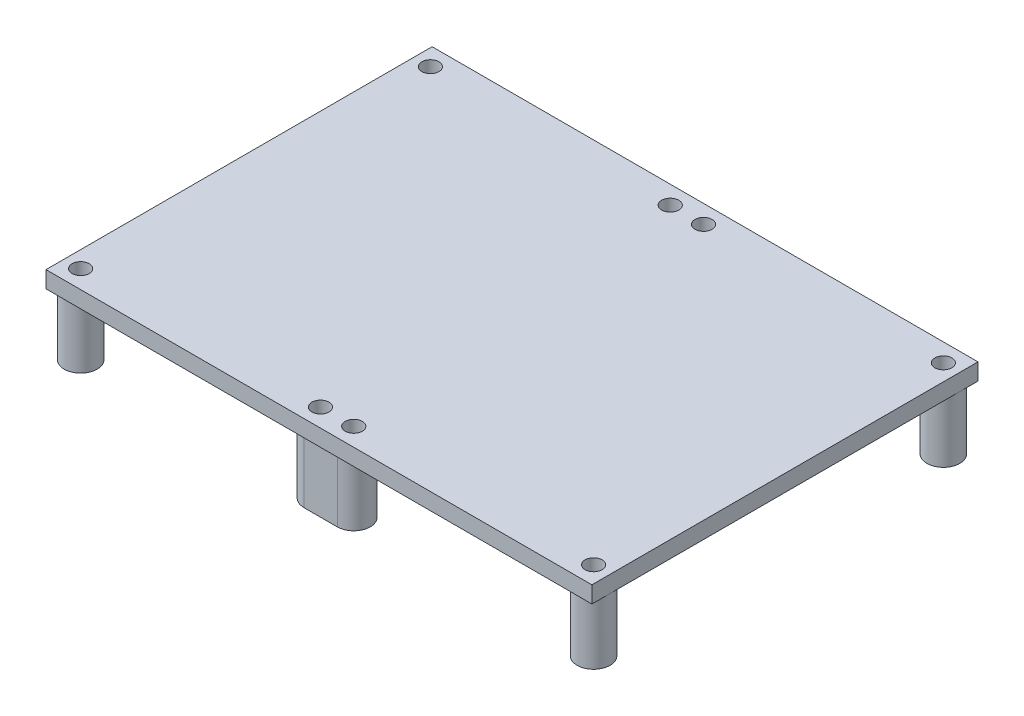
ISO-10303-21;
HEADER;
FILE_DESCRIPTION(('STEP AP214'),'2;1');
FILE_NAME('part.step','',(''),(''),'','','');
FILE_SCHEMA(('AUTOMOTIVE_DESIGN { 1 0 10303 214 1 1 1 1 }'));
ENDSEC;
DATA;
#1=APPLICATION_CONTEXT('core data for automotive mechanical design processes');
#2=APPLICATION_PROTOCOL_DEFINITION('international standard','automotive_design',2000,#1);
#3=PRODUCT_CONTEXT('',#1,'mechanical');
#4=PRODUCT('Part','Part','',(#3));
#5=PRODUCT_RELATED_PRODUCT_CATEGORY('part','',(#4));
#6=PRODUCT_DEFINITION_FORMATION('','',#4);
#7=PRODUCT_DEFINITION_CONTEXT('part definition',#1,'design');
#8=PRODUCT_DEFINITION('design','',#6,#7);
#9=PRODUCT_DEFINITION_SHAPE('','',#8);
#10=(LENGTH_UNIT() NAMED_UNIT(*) SI_UNIT(.MILLI.,.METRE.));
#11=(NAMED_UNIT(*) PLANE_ANGLE_UNIT() SI_UNIT($,.RADIAN.));
#12=(NAMED_UNIT(*) SI_UNIT($,.STERADIAN.) SOLID_ANGLE_UNIT());
#13=UNCERTAINTY_MEASURE_WITH_UNIT(LENGTH_MEASURE(1.E-05),#10,'distance_accuracy_value','');
#14=(GEOMETRIC_REPRESENTATION_CONTEXT(3) GLOBAL_UNCERTAINTY_ASSIGNED_CONTEXT((#13)) GLOBAL_UNIT_ASSIGNED_CONTEXT((#10,
#11,#12)) REPRESENTATION_CONTEXT('',''));
#15=CARTESIAN_POINT('',(0.,0.,0.));
#16=DIRECTION('',(0.,0.,1.));
#17=DIRECTION('',(1.,0.,0.));
#18=AXIS2_PLACEMENT_3D('',#15,#16,#17);
#19=CARTESIAN_POINT('',(0.,-15.04124999999,0.));
#20=DIRECTION('',(0.,1.,0.));
#21=DIRECTION('',(0.,0.,1.));
#22=AXIS2_PLACEMENT_3D('',#19,#20,#21);
#23=PLANE('',#22);
#24=CARTESIAN_POINT('',(-48.895,-15.04124999999,-33.34));
#25=DIRECTION('',(0.,1.,0.));
#26=DIRECTION('',(0.,0.,1.));
#27=AXIS2_PLACEMENT_3D('',#24,#25,#26);
#28=CIRCLE('',#27,3.14000000000001);
#29=CARTESIAN_POINT('',(-48.895,-15.04124999999,-30.2));
#30=VERTEX_POINT('',#29);
#31=EDGE_CURVE('E275',#30,#30,#28,.T.);
#32=ORIENTED_EDGE('',*,*,#31,.F.);
#33=EDGE_LOOP('',(#32));
#34=FACE_BOUND('',#33,.T.);
#35=CARTESIAN_POINT('',(-48.895,-15.04124999999,-33.34));
#36=DIRECTION('',(0.,-1.,0.));
#37=DIRECTION('',(0.,0.,-1.));
#38=AXIS2_PLACEMENT_3D('',#35,#36,#37);
#39=CIRCLE('',#38,1.63195);
#40=CARTESIAN_POINT('',(-48.895,-15.04124999999,-34.97195));
#41=VERTEX_POINT('',#40);
#42=EDGE_CURVE('E212',#41,#41,#39,.T.);
#43=ORIENTED_EDGE('',*,*,#42,.F.);
#44=EDGE_LOOP('',(#43));
#45=FACE_BOUND('',#44,.T.);
#46=ADVANCED_FACE('F41',(#34,#45),#23,.F.);
#47=CARTESIAN_POINT('',(0.,-15.04124999999,0.));
#48=DIRECTION('',(0.,1.,0.));
#49=DIRECTION('',(0.,0.,1.));
#50=AXIS2_PLACEMENT_3D('',#47,#48,#49);
#51=PLANE('',#50);
#52=CARTESIAN_POINT('',(-3.175,-15.04124999999,-33.34));
#53=DIRECTION('',(0.,1.,0.));
#54=DIRECTION('',(0.,0.,1.));
#55=AXIS2_PLACEMENT_3D('',#52,#53,#54);
#56=CIRCLE('',#55,3.14);
#57=CARTESIAN_POINT('',(-3.175,-15.04124999999,-36.48));
#58=VERTEX_POINT('',#57);
#59=CARTESIAN_POINT('',(-3.175,-15.04124999999,-30.2));
#60=VERTEX_POINT('',#59);
#61=EDGE_CURVE('E152',#58,#60,#56,.T.);
#62=ORIENTED_EDGE('',*,*,#61,.F.);
#63=DIRECTION('',(1.,0.,0.));
#64=VECTOR('',#63,1.);
#65=CARTESIAN_POINT('',(0.,-15.04124999999,-36.48));
#66=LINE('',#65,#64);
#67=CARTESIAN_POINT('',(3.17499999999999,-15.04124999999,-36.48));
#68=VERTEX_POINT('',#67);
#69=EDGE_CURVE('E151',#58,#68,#66,.T.);
#70=ORIENTED_EDGE('',*,*,#69,.T.);
#71=CARTESIAN_POINT('',(3.17499999999999,-15.04124999999,-33.34));
#72=DIRECTION('',(0.,-1.,0.));
#73=DIRECTION('',(0.,0.,1.));
#74=AXIS2_PLACEMENT_3D('',#71,#72,#73);
#75=CIRCLE('',#74,3.14);
#76=CARTESIAN_POINT('',(3.17499999999999,-15.04124999999,-30.2));
#77=VERTEX_POINT('',#76);
#78=EDGE_CURVE('E158',#68,#77,#75,.T.);
#79=ORIENTED_EDGE('',*,*,#78,.T.);
#80=DIRECTION('',(1.,0.,0.));
#81=VECTOR('',#80,1.);
#82=CARTESIAN_POINT('',(0.,-15.04124999999,-30.2));
#83=LINE('',#82,#81);
#84=EDGE_CURVE('E140',#60,#77,#83,.T.);
#85=ORIENTED_EDGE('',*,*,#84,.F.);
#86=EDGE_LOOP('',(#62,#70,#79,#85));
#87=FACE_BOUND('',#86,.T.);
#88=CARTESIAN_POINT('',(-3.175,-15.04124999999,-33.34));
#89=DIRECTION('',(0.,-1.,0.));
#90=DIRECTION('',(0.,0.,-1.));
#91=AXIS2_PLACEMENT_3D('',#88,#89,#90);
#92=CIRCLE('',#91,1.63195);
#93=CARTESIAN_POINT('',(-3.175,-15.04124999999,-34.97195));
#94=VERTEX_POINT('',#93);
#95=EDGE_CURVE('E220',#94,#94,#92,.T.);
#96=ORIENTED_EDGE('',*,*,#95,.F.);
#97=EDGE_LOOP('',(#96));
#98=FACE_BOUND('',#97,.T.);
#99=CARTESIAN_POINT('',(3.17499999999999,-15.04124999999,-33.34));
#100=DIRECTION('',(0.,1.,0.));
#101=DIRECTION('',(0.,0.,-1.));
#102=AXIS2_PLACEMENT_3D('',#99,#100,#101);
#103=CIRCLE('',#102,1.63195);
#104=CARTESIAN_POINT('',(3.17499999999999,-15.04124999999,-34.97195));
#105=VERTEX_POINT('',#104);
#106=EDGE_CURVE('E767',#105,#105,#103,.T.);
#107=ORIENTED_EDGE('',*,*,#106,.T.);
#108=EDGE_LOOP('',(#107));
#109=FACE_BOUND('',#108,.T.);
#110=ADVANCED_FACE('F163',(#87,#98,#109),#51,.F.);
#111=CARTESIAN_POINT('',(0.,-3.175,0.));
#112=DIRECTION('',(0.,1.,0.));
#113=DIRECTION('',(0.,0.,1.));
#114=AXIS2_PLACEMENT_3D('',#111,#112,#113);
#115=PLANE('',#114);
#116=CARTESIAN_POINT('',(3.17500000000001,-3.175,33.34));
#117=DIRECTION('',(0.,-1.,0.));
#118=DIRECTION('',(0.,0.,1.));
#119=AXIS2_PLACEMENT_3D('',#116,#117,#118);
#120=CIRCLE('',#119,3.14);
#121=CARTESIAN_POINT('',(3.17500000000001,-3.175,30.2));
#122=VERTEX_POINT('',#121);
#123=CARTESIAN_POINT('',(3.17500000000001,-3.175,36.48));
#124=VERTEX_POINT('',#123);
#125=EDGE_CURVE('E183',#122,#124,#120,.T.);
#126=ORIENTED_EDGE('',*,*,#125,.F.);
#127=DIRECTION('',(1.,0.,0.));
#128=VECTOR('',#127,1.);
#129=CARTESIAN_POINT('',(0.,-3.175,30.2));
#130=LINE('',#129,#128);
#131=CARTESIAN_POINT('',(-3.175,-3.175,30.2));
#132=VERTEX_POINT('',#131);
#133=EDGE_CURVE('E266',#132,#122,#130,.T.);
#134=ORIENTED_EDGE('',*,*,#133,.F.);
#135=CARTESIAN_POINT('',(-3.175,-3.175,33.34));
#136=DIRECTION('',(0.,1.,0.));
#137=DIRECTION('',(0.,0.,1.));
#138=AXIS2_PLACEMENT_3D('',#135,#136,#137);
#139=CIRCLE('',#138,3.14);
#140=CARTESIAN_POINT('',(-3.175,-3.175,36.48));
#141=VERTEX_POINT('',#140);
#142=EDGE_CURVE('E268',#132,#141,#139,.T.);
#143=ORIENTED_EDGE('',*,*,#142,.T.);
#144=DIRECTION('',(1.,0.,0.));
#145=VECTOR('',#144,1.);
#146=CARTESIAN_POINT('',(0.,-3.175,36.48));
#147=LINE('',#146,#145);
#148=EDGE_CURVE('E262',#141,#124,#147,.T.);
#149=ORIENTED_EDGE('',*,*,#148,.T.);
#150=EDGE_LOOP('',(#126,#134,#143,#149));
#151=FACE_BOUND('',#150,.T.);
#152=CARTESIAN_POINT('',(3.17499999999999,-3.175,-33.34));
#153=DIRECTION('',(0.,-1.,0.));
#154=DIRECTION('',(0.,0.,1.));
#155=AXIS2_PLACEMENT_3D('',#152,#153,#154);
#156=CIRCLE('',#155,3.14);
#157=CARTESIAN_POINT('',(3.17499999999999,-3.175,-36.48));
#158=VERTEX_POINT('',#157);
#159=CARTESIAN_POINT('',(3.17499999999999,-3.175,-30.2));
#160=VERTEX_POINT('',#159);
#161=EDGE_CURVE('E160',#158,#160,#156,.T.);
#162=ORIENTED_EDGE('',*,*,#161,.F.);
#163=DIRECTION('',(1.,0.,0.));
#164=VECTOR('',#163,1.);
#165=CARTESIAN_POINT('',(0.,-3.175,-36.48));
#166=LINE('',#165,#164);
#167=CARTESIAN_POINT('',(-3.175,-3.175,-36.48));
#168=VERTEX_POINT('',#167);
#169=EDGE_CURVE('E246',#168,#158,#166,.T.);
#170=ORIENTED_EDGE('',*,*,#169,.F.);
#171=CARTESIAN_POINT('',(-3.175,-3.175,-33.34));
#172=DIRECTION('',(0.,1.,0.));
#173=DIRECTION('',(0.,0.,1.));
#174=AXIS2_PLACEMENT_3D('',#171,#172,#173);
#175=CIRCLE('',#174,3.14);
#176=CARTESIAN_POINT('',(-3.175,-3.175,-30.2));
#177=VERTEX_POINT('',#176);
#178=EDGE_CURVE('E248',#168,#177,#175,.T.);
#179=ORIENTED_EDGE('',*,*,#178,.T.);
#180=DIRECTION('',(1.,0.,0.));
#181=VECTOR('',#180,1.);
#182=CARTESIAN_POINT('',(0.,-3.175,-30.2));
#183=LINE('',#182,#181);
#184=EDGE_CURVE('E243',#177,#160,#183,.T.);
#185=ORIENTED_EDGE('',*,*,#184,.T.);
#186=EDGE_LOOP('',(#162,#170,#179,#185));
#187=FACE_BOUND('',#186,.T.);
#188=DIRECTION('',(1.,0.,1.98254111540185E-13));
#189=VECTOR('',#188,1.);
#190=CARTESIAN_POINT('',(7.29674257523651E-12,-3.175,-36.805));
#191=LINE('',#190,#189);
#192=CARTESIAN_POINT('',(-52.035,-3.175,-36.805));
#193=VERTEX_POINT('',#192);
#194=CARTESIAN_POINT('',(52.035,-3.175,-36.805));
#195=VERTEX_POINT('',#194);
#196=EDGE_CURVE('E283',#193,#195,#191,.T.);
#197=ORIENTED_EDGE('',*,*,#196,.T.);
#198=DIRECTION('',(0.,0.,1.));
#199=VECTOR('',#198,1.);
#200=CARTESIAN_POINT('',(52.035,-3.175,0.));
#201=LINE('',#200,#199);
#202=CARTESIAN_POINT('',(52.035,-3.175,-33.34));
#203=VERTEX_POINT('',#202);
#204=EDGE_CURVE('E201',#195,#203,#201,.T.);
#205=ORIENTED_EDGE('',*,*,#204,.T.);
#206=CARTESIAN_POINT('',(48.895,-3.175,-33.34));
#207=DIRECTION('',(0.,-1.,0.));
#208=DIRECTION('',(0.,0.,1.));
#209=AXIS2_PLACEMENT_3D('',#206,#207,#208);
#210=CIRCLE('',#209,3.14000000000001);
#211=EDGE_CURVE('E197',#203,#203,#210,.T.);
#212=ORIENTED_EDGE('',*,*,#211,.F.);
#213=CARTESIAN_POINT('',(52.035,-3.175,33.34));
#214=VERTEX_POINT('',#213);
#215=EDGE_CURVE('E205',#203,#214,#201,.T.);
#216=ORIENTED_EDGE('',*,*,#215,.T.);
#217=CARTESIAN_POINT('',(48.895,-3.175,33.34));
#218=DIRECTION('',(0.,-1.,0.));
#219=DIRECTION('',(0.,0.,1.));
#220=AXIS2_PLACEMENT_3D('',#217,#218,#219);
#221=CIRCLE('',#220,3.14000000000001);
#222=EDGE_CURVE('E191',#214,#214,#221,.T.);
#223=ORIENTED_EDGE('',*,*,#222,.F.);
#224=CARTESIAN_POINT('',(52.035,-3.175,36.805));
#225=VERTEX_POINT('',#224);
#226=EDGE_CURVE('E206',#214,#225,#201,.T.);
#227=ORIENTED_EDGE('',*,*,#226,.T.);
#228=DIRECTION('',(-1.,0.,0.));
#229=VECTOR('',#228,1.);
#230=CARTESIAN_POINT('',(0.,-3.175,36.805));
#231=LINE('',#230,#229);
#232=CARTESIAN_POINT('',(-52.035,-3.175,36.805));
#233=VERTEX_POINT('',#232);
#234=EDGE_CURVE('E280',#225,#233,#231,.T.);
#235=ORIENTED_EDGE('',*,*,#234,.T.);
#236=DIRECTION('',(0.,0.,1.));
#237=VECTOR('',#236,1.);
#238=CARTESIAN_POINT('',(-52.035,-3.175,0.));
#239=LINE('',#238,#237);
#240=CARTESIAN_POINT('',(-52.035,-3.175,33.34));
#241=VERTEX_POINT('',#240);
#242=EDGE_CURVE('E286',#241,#233,#239,.T.);
#243=ORIENTED_EDGE('',*,*,#242,.F.);
#244=CARTESIAN_POINT('',(-48.895,-3.175,33.34));
#245=DIRECTION('',(0.,1.,0.));
#246=DIRECTION('',(0.,0.,1.));
#247=AXIS2_PLACEMENT_3D('',#244,#245,#246);
#248=CIRCLE('',#247,3.14000000000001);
#249=EDGE_CURVE('E54',#241,#241,#248,.T.);
#250=ORIENTED_EDGE('',*,*,#249,.T.);
#251=CARTESIAN_POINT('',(-52.035,-3.175,-33.34));
#252=VERTEX_POINT('',#251);
#253=EDGE_CURVE('E290',#252,#241,#239,.T.);
#254=ORIENTED_EDGE('',*,*,#253,.F.);
#255=CARTESIAN_POINT('',(-48.895,-3.175,-33.34));
#256=DIRECTION('',(0.,1.,0.));
#257=DIRECTION('',(0.,0.,1.));
#258=AXIS2_PLACEMENT_3D('',#255,#256,#257);
#259=CIRCLE('',#258,3.14000000000001);
#260=EDGE_CURVE('E59',#252,#252,#259,.T.);
#261=ORIENTED_EDGE('',*,*,#260,.T.);
#262=EDGE_CURVE('E287',#193,#252,#239,.T.);
#263=ORIENTED_EDGE('',*,*,#262,.F.);
#264=EDGE_LOOP('',(#197,#205,#212,#216,#223,#227,#235,#243,#250,#254,#261,#263));
#265=FACE_BOUND('',#264,.T.);
#266=ADVANCED_FACE('F313',(#151,#187,#265),#115,.F.);
#267=CARTESIAN_POINT('',(0.,-3.175,36.805));
#268=DIRECTION('',(0.,0.,-1.));
#269=DIRECTION('',(-1.,0.,0.));
#270=AXIS2_PLACEMENT_3D('',#267,#268,#269);
#271=PLANE('',#270);
#272=DIRECTION('',(-1.,0.,0.));
#273=VECTOR('',#272,1.);
#274=CARTESIAN_POINT('',(0.,0.,36.805));
#275=LINE('',#274,#273);
#276=CARTESIAN_POINT('',(52.035,0.,36.805));
#277=VERTEX_POINT('',#276);
#278=CARTESIAN_POINT('',(-52.035,0.,36.805));
#279=VERTEX_POINT('',#278);
#280=EDGE_CURVE('E279',#277,#279,#275,.T.);
#281=ORIENTED_EDGE('',*,*,#280,.T.);
#282=DIRECTION('',(0.,1.,0.));
#283=VECTOR('',#282,1.);
#284=CARTESIAN_POINT('',(-52.035,-3.175,36.805));
#285=LINE('',#284,#283);
#286=EDGE_CURVE('E11',#233,#279,#285,.T.);
#287=ORIENTED_EDGE('',*,*,#286,.F.);
#288=ORIENTED_EDGE('',*,*,#234,.F.);
#289=DIRECTION('',(0.,1.,0.));
#290=VECTOR('',#289,1.);
#291=CARTESIAN_POINT('',(52.035,-3.175,36.805));
#292=LINE('',#291,#290);
#293=EDGE_CURVE('E209',#225,#277,#292,.T.);
#294=ORIENTED_EDGE('',*,*,#293,.T.);
#295=EDGE_LOOP('',(#281,#287,#288,#294));
#296=FACE_BOUND('',#295,.T.);
#297=ADVANCED_FACE('F43',(#296),#271,.F.);
#298=CARTESIAN_POINT('',(-52.035,-3.175,0.));
#299=DIRECTION('',(-1.,0.,0.));
#300=DIRECTION('',(0.,0.,1.));
#301=AXIS2_PLACEMENT_3D('',#298,#299,#300);
#302=PLANE('',#301);
#303=ORIENTED_EDGE('',*,*,#286,.T.);
#304=DIRECTION('',(0.,0.,1.));
#305=VECTOR('',#304,1.);
#306=CARTESIAN_POINT('',(-52.035,0.,0.));
#307=LINE('',#306,#305);
#308=CARTESIAN_POINT('',(-52.035,0.,-36.805));
#309=VERTEX_POINT('',#308);
#310=EDGE_CURVE('E284',#309,#279,#307,.T.);
#311=ORIENTED_EDGE('',*,*,#310,.F.);
#312=DIRECTION('',(0.,1.,0.));
#313=VECTOR('',#312,1.);
#314=CARTESIAN_POINT('',(-52.035,-3.175,-36.805));
#315=LINE('',#314,#313);
#316=EDGE_CURVE('E45',#193,#309,#315,.T.);
#317=ORIENTED_EDGE('',*,*,#316,.F.);
#318=ORIENTED_EDGE('',*,*,#262,.T.);
#319=ORIENTED_EDGE('',*,*,#253,.T.);
#320=ORIENTED_EDGE('',*,*,#242,.T.);
#321=EDGE_LOOP('',(#303,#311,#317,#318,#319,#320));
#322=FACE_BOUND('',#321,.T.);
#323=ADVANCED_FACE('F303',(#322),#302,.T.);
#324=CARTESIAN_POINT('',(7.29674257523651E-12,-3.175,-36.805));
#325=DIRECTION('',(-1.98254111540185E-13,0.,1.));
#326=DIRECTION('',(1.,0.,1.98254111540185E-13));
#327=AXIS2_PLACEMENT_3D('',#324,#325,#326);
#328=PLANE('',#327);
#329=DIRECTION('',(1.,0.,1.98254111540185E-13));
#330=VECTOR('',#329,1.);
#331=CARTESIAN_POINT('',(7.29674257523651E-12,0.,-36.805));
#332=LINE('',#331,#330);
#333=CARTESIAN_POINT('',(52.035,0.,-36.805));
#334=VERTEX_POINT('',#333);
#335=EDGE_CURVE('E293',#309,#334,#332,.T.);
#336=ORIENTED_EDGE('',*,*,#335,.T.);
#337=DIRECTION('',(0.,1.,0.));
#338=VECTOR('',#337,1.);
#339=CARTESIAN_POINT('',(52.035,-3.175,-36.805));
#340=LINE('',#339,#338);
#341=EDGE_CURVE('E204',#195,#334,#340,.T.);
#342=ORIENTED_EDGE('',*,*,#341,.F.);
#343=ORIENTED_EDGE('',*,*,#196,.F.);
#344=ORIENTED_EDGE('',*,*,#316,.T.);
#345=EDGE_LOOP('',(#336,#342,#343,#344));
#346=FACE_BOUND('',#345,.T.);
#347=ADVANCED_FACE('F356',(#346),#328,.F.);
#348=CARTESIAN_POINT('',(0.,0.,0.));
#349=DIRECTION('',(0.,1.,0.));
#350=DIRECTION('',(0.,0.,1.));
#351=AXIS2_PLACEMENT_3D('',#348,#349,#350);
#352=PLANE('',#351);
#353=CARTESIAN_POINT('',(-48.895,0.,-33.34));
#354=DIRECTION('',(0.,1.,0.));
#355=DIRECTION('',(0.,0.,1.));
#356=AXIS2_PLACEMENT_3D('',#353,#354,#355);
#357=CIRCLE('',#356,1.63195);
#358=CARTESIAN_POINT('',(-48.895,0.,-31.70805));
#359=VERTEX_POINT('',#358);
#360=EDGE_CURVE('E217',#359,#359,#357,.T.);
#361=ORIENTED_EDGE('',*,*,#360,.F.);
#362=EDGE_LOOP('',(#361));
#363=FACE_BOUND('',#362,.T.);
#364=CARTESIAN_POINT('',(-3.175,0.,-33.34));
#365=DIRECTION('',(0.,1.,0.));
#366=DIRECTION('',(0.,0.,1.));
#367=AXIS2_PLACEMENT_3D('',#364,#365,#366);
#368=CIRCLE('',#367,1.63195);
#369=CARTESIAN_POINT('',(-3.175,0.,-31.70805));
#370=VERTEX_POINT('',#369);
#371=EDGE_CURVE('E223',#370,#370,#368,.T.);
#372=ORIENTED_EDGE('',*,*,#371,.F.);
#373=EDGE_LOOP('',(#372));
#374=FACE_BOUND('',#373,.T.);
#375=CARTESIAN_POINT('',(-3.175,0.,33.34));
#376=DIRECTION('',(0.,1.,0.));
#377=DIRECTION('',(0.,0.,1.));
#378=AXIS2_PLACEMENT_3D('',#375,#376,#377);
#379=CIRCLE('',#378,1.63195);
#380=CARTESIAN_POINT('',(-3.175,0.,34.97195));
#381=VERTEX_POINT('',#380);
#382=EDGE_CURVE('E229',#381,#381,#379,.T.);
#383=ORIENTED_EDGE('',*,*,#382,.F.);
#384=EDGE_LOOP('',(#383));
#385=FACE_BOUND('',#384,.T.);
#386=CARTESIAN_POINT('',(-48.895,0.,33.34));
#387=DIRECTION('',(0.,1.,0.));
#388=DIRECTION('',(0.,0.,1.));
#389=AXIS2_PLACEMENT_3D('',#386,#387,#388);
#390=CIRCLE('',#389,1.63195);
#391=CARTESIAN_POINT('',(-48.895,0.,34.97195));
#392=VERTEX_POINT('',#391);
#393=EDGE_CURVE('E235',#392,#392,#390,.T.);
#394=ORIENTED_EDGE('',*,*,#393,.F.);
#395=EDGE_LOOP('',(#394));
#396=FACE_BOUND('',#395,.T.);
#397=ORIENTED_EDGE('',*,*,#280,.F.);
#398=DIRECTION('',(0.,0.,1.));
#399=VECTOR('',#398,1.);
#400=CARTESIAN_POINT('',(52.035,0.,0.));
#401=LINE('',#400,#399);
#402=EDGE_CURVE('E200',#334,#277,#401,.T.);
#403=ORIENTED_EDGE('',*,*,#402,.F.);
#404=ORIENTED_EDGE('',*,*,#335,.F.);
#405=ORIENTED_EDGE('',*,*,#310,.T.);
#406=EDGE_LOOP('',(#397,#403,#404,#405));
#407=FACE_BOUND('',#406,.T.);
#408=CARTESIAN_POINT('',(48.895,0.,-33.34));
#409=DIRECTION('',(0.,-1.,0.));
#410=DIRECTION('',(0.,0.,1.));
#411=AXIS2_PLACEMENT_3D('',#408,#409,#410);
#412=CIRCLE('',#411,1.63195);
#413=CARTESIAN_POINT('',(48.895,0.,-31.70805));
#414=VERTEX_POINT('',#413);
#415=EDGE_CURVE('E761',#414,#414,#412,.T.);
#416=ORIENTED_EDGE('',*,*,#415,.T.);
#417=EDGE_LOOP('',(#416));
#418=FACE_BOUND('',#417,.T.);
#419=CARTESIAN_POINT('',(3.17499999999999,0.,-33.34));
#420=DIRECTION('',(0.,-1.,0.));
#421=DIRECTION('',(0.,0.,1.));
#422=AXIS2_PLACEMENT_3D('',#419,#420,#421);
#423=CIRCLE('',#422,1.63195);
#424=CARTESIAN_POINT('',(3.17499999999999,0.,-31.70805));
#425=VERTEX_POINT('',#424);
#426=EDGE_CURVE('E772',#425,#425,#423,.T.);
#427=ORIENTED_EDGE('',*,*,#426,.T.);
#428=EDGE_LOOP('',(#427));
#429=FACE_BOUND('',#428,.T.);
#430=CARTESIAN_POINT('',(3.17500000000001,0.,33.34));
#431=DIRECTION('',(0.,-1.,0.));
#432=DIRECTION('',(0.,0.,1.));
#433=AXIS2_PLACEMENT_3D('',#430,#431,#432);
#434=CIRCLE('',#433,1.63195);
#435=CARTESIAN_POINT('',(3.17500000000001,0.,34.97195));
#436=VERTEX_POINT('',#435);
#437=EDGE_CURVE('E778',#436,#436,#434,.T.);
#438=ORIENTED_EDGE('',*,*,#437,.T.);
#439=EDGE_LOOP('',(#438));
#440=FACE_BOUND('',#439,.T.);
#441=CARTESIAN_POINT('',(48.895,0.,33.34));
#442=DIRECTION('',(0.,-1.,0.));
#443=DIRECTION('',(0.,0.,1.));
#444=AXIS2_PLACEMENT_3D('',#441,#442,#443);
#445=CIRCLE('',#444,1.63195);
#446=CARTESIAN_POINT('',(48.895,0.,34.97195));
#447=VERTEX_POINT('',#446);
#448=EDGE_CURVE('E167',#447,#447,#445,.T.);
#449=ORIENTED_EDGE('',*,*,#448,.T.);
#450=EDGE_LOOP('',(#449));
#451=FACE_BOUND('',#450,.T.);
#452=ADVANCED_FACE('F298',(#363,#374,#385,#396,#407,#418,#429,#440,#451),#352,.T.);
#453=CARTESIAN_POINT('',(-48.895,-15.04124999999,-33.34));
#454=DIRECTION('',(0.,1.,0.));
#455=DIRECTION('',(0.,0.,1.));
#456=AXIS2_PLACEMENT_3D('',#453,#454,#455);
#457=CYLINDRICAL_SURFACE('',#456,3.14000000000001);
#458=ORIENTED_EDGE('',*,*,#31,.T.);
#459=EDGE_LOOP('',(#458));
#460=FACE_BOUND('',#459,.T.);
#461=ORIENTED_EDGE('',*,*,#260,.F.);
#462=EDGE_LOOP('',(#461));
#463=FACE_BOUND('',#462,.T.);
#464=ADVANCED_FACE('F347',(#460,#463),#457,.T.);
#465=CARTESIAN_POINT('',(-48.895,-15.04124999999,33.34));
#466=DIRECTION('',(0.,1.,0.));
#467=DIRECTION('',(0.,0.,1.));
#468=AXIS2_PLACEMENT_3D('',#465,#466,#467);
#469=CYLINDRICAL_SURFACE('',#468,3.14000000000001);
#470=CARTESIAN_POINT('',(-48.895,-15.04124999999,33.34));
#471=DIRECTION('',(0.,1.,0.));
#472=DIRECTION('',(0.,0.,1.));
#473=AXIS2_PLACEMENT_3D('',#470,#471,#472);
#474=CIRCLE('',#473,3.14000000000001);
#475=CARTESIAN_POINT('',(-48.895,-15.04124999999,36.48));
#476=VERTEX_POINT('',#475);
#477=EDGE_CURVE('E271',#476,#476,#474,.T.);
#478=ORIENTED_EDGE('',*,*,#477,.T.);
#479=EDGE_LOOP('',(#478));
#480=FACE_BOUND('',#479,.T.);
#481=ORIENTED_EDGE('',*,*,#249,.F.);
#482=EDGE_LOOP('',(#481));
#483=FACE_BOUND('',#482,.T.);
#484=ADVANCED_FACE('F345',(#480,#483),#469,.T.);
#485=CARTESIAN_POINT('',(0.,-15.04124999999,0.));
#486=DIRECTION('',(0.,1.,0.));
#487=DIRECTION('',(0.,0.,1.));
#488=AXIS2_PLACEMENT_3D('',#485,#486,#487);
#489=PLANE('',#488);
#490=CARTESIAN_POINT('',(-48.895,-15.04124999999,33.34));
#491=DIRECTION('',(0.,-1.,0.));
#492=DIRECTION('',(0.,0.,-1.));
#493=AXIS2_PLACEMENT_3D('',#490,#491,#492);
#494=CIRCLE('',#493,1.63195);
#495=CARTESIAN_POINT('',(-48.895,-15.04124999999,31.70805));
#496=VERTEX_POINT('',#495);
#497=EDGE_CURVE('E232',#496,#496,#494,.T.);
#498=ORIENTED_EDGE('',*,*,#497,.F.);
#499=EDGE_LOOP('',(#498));
#500=FACE_BOUND('',#499,.T.);
#501=ORIENTED_EDGE('',*,*,#477,.F.);
#502=EDGE_LOOP('',(#501));
#503=FACE_BOUND('',#502,.T.);
#504=ADVANCED_FACE('F388',(#500,#503),#489,.F.);
#505=CARTESIAN_POINT('',(-3.175,-15.04124999999,33.34));
#506=DIRECTION('',(0.,1.,0.));
#507=DIRECTION('',(0.,0.,1.));
#508=AXIS2_PLACEMENT_3D('',#505,#506,#507);
#509=CYLINDRICAL_SURFACE('',#508,3.14);
#510=ORIENTED_EDGE('',*,*,#142,.F.);
#511=DIRECTION('',(0.,1.,0.));
#512=VECTOR('',#511,1.);
#513=CARTESIAN_POINT('',(-3.175,-15.04124999999,30.2));
#514=LINE('',#513,#512);
#515=CARTESIAN_POINT('',(-3.175,-15.04124999999,30.2));
#516=VERTEX_POINT('',#515);
#517=EDGE_CURVE('E259',#516,#132,#514,.T.);
#518=ORIENTED_EDGE('',*,*,#517,.F.);
#519=CARTESIAN_POINT('',(-3.175,-15.04124999999,33.34));
#520=DIRECTION('',(0.,1.,0.));
#521=DIRECTION('',(0.,0.,1.));
#522=AXIS2_PLACEMENT_3D('',#519,#520,#521);
#523=CIRCLE('',#522,3.14);
#524=CARTESIAN_POINT('',(-3.175,-15.04124999999,36.48));
#525=VERTEX_POINT('',#524);
#526=EDGE_CURVE('E251',#516,#525,#523,.T.);
#527=ORIENTED_EDGE('',*,*,#526,.T.);
#528=DIRECTION('',(0.,1.,0.));
#529=VECTOR('',#528,1.);
#530=CARTESIAN_POINT('',(-3.175,-15.04124999999,36.48));
#531=LINE('',#530,#529);
#532=EDGE_CURVE('E258',#525,#141,#531,.T.);
#533=ORIENTED_EDGE('',*,*,#532,.T.);
#534=EDGE_LOOP('',(#510,#518,#527,#533));
#535=FACE_BOUND('',#534,.T.);
#536=ADVANCED_FACE('F397',(#535),#509,.T.);
#537=CARTESIAN_POINT('',(0.,-15.04124999999,30.2));
#538=DIRECTION('',(0.,0.,1.));
#539=DIRECTION('',(1.,0.,0.));
#540=AXIS2_PLACEMENT_3D('',#537,#538,#539);
#541=PLANE('',#540);
#542=ORIENTED_EDGE('',*,*,#517,.T.);
#543=ORIENTED_EDGE('',*,*,#133,.T.);
#544=DIRECTION('',(0.,1.,0.));
#545=VECTOR('',#544,1.);
#546=CARTESIAN_POINT('',(3.17500000000001,-15.04124999999,30.2));
#547=LINE('',#546,#545);
#548=CARTESIAN_POINT('',(3.17500000000001,-15.04124999999,30.2));
#549=VERTEX_POINT('',#548);
#550=EDGE_CURVE('E180',#549,#122,#547,.T.);
#551=ORIENTED_EDGE('',*,*,#550,.F.);
#552=DIRECTION('',(1.,0.,0.));
#553=VECTOR('',#552,1.);
#554=CARTESIAN_POINT('',(0.,-15.04124999999,30.2));
#555=LINE('',#554,#553);
#556=EDGE_CURVE('E256',#516,#549,#555,.T.);
#557=ORIENTED_EDGE('',*,*,#556,.F.);
#558=EDGE_LOOP('',(#542,#543,#551,#557));
#559=FACE_BOUND('',#558,.T.);
#560=ADVANCED_FACE('F406',(#559),#541,.F.);
#561=CARTESIAN_POINT('',(0.,-15.04124999999,36.48));
#562=DIRECTION('',(0.,0.,1.));
#563=DIRECTION('',(1.,0.,0.));
#564=AXIS2_PLACEMENT_3D('',#561,#562,#563);
#565=PLANE('',#564);
#566=ORIENTED_EDGE('',*,*,#148,.F.);
#567=ORIENTED_EDGE('',*,*,#532,.F.);
#568=DIRECTION('',(1.,0.,0.));
#569=VECTOR('',#568,1.);
#570=CARTESIAN_POINT('',(0.,-15.04124999999,36.48));
#571=LINE('',#570,#569);
#572=CARTESIAN_POINT('',(3.17500000000001,-15.04124999999,36.48));
#573=VERTEX_POINT('',#572);
#574=EDGE_CURVE('E254',#525,#573,#571,.T.);
#575=ORIENTED_EDGE('',*,*,#574,.T.);
#576=DIRECTION('',(0.,1.,0.));
#577=VECTOR('',#576,1.);
#578=CARTESIAN_POINT('',(3.17500000000001,-15.04124999999,36.48));
#579=LINE('',#578,#577);
#580=EDGE_CURVE('E179',#573,#124,#579,.T.);
#581=ORIENTED_EDGE('',*,*,#580,.T.);
#582=EDGE_LOOP('',(#566,#567,#575,#581));
#583=FACE_BOUND('',#582,.T.);
#584=ADVANCED_FACE('F413',(#583),#565,.T.);
#585=CARTESIAN_POINT('',(0.,-15.04124999999,0.));
#586=DIRECTION('',(0.,1.,0.));
#587=DIRECTION('',(0.,0.,1.));
#588=AXIS2_PLACEMENT_3D('',#585,#586,#587);
#589=PLANE('',#588);
#590=CARTESIAN_POINT('',(-3.175,-15.04124999999,33.34));
#591=DIRECTION('',(0.,-1.,0.));
#592=DIRECTION('',(0.,0.,-1.));
#593=AXIS2_PLACEMENT_3D('',#590,#591,#592);
#594=CIRCLE('',#593,1.63195);
#595=CARTESIAN_POINT('',(-3.175,-15.04124999999,31.70805));
#596=VERTEX_POINT('',#595);
#597=EDGE_CURVE('E226',#596,#596,#594,.T.);
#598=ORIENTED_EDGE('',*,*,#597,.F.);
#599=EDGE_LOOP('',(#598));
#600=FACE_BOUND('',#599,.T.);
#601=ORIENTED_EDGE('',*,*,#526,.F.);
#602=ORIENTED_EDGE('',*,*,#556,.T.);
#603=CARTESIAN_POINT('',(3.17500000000001,-15.04124999999,33.34));
#604=DIRECTION('',(0.,-1.,0.));
#605=DIRECTION('',(0.,0.,1.));
#606=AXIS2_PLACEMENT_3D('',#603,#604,#605);
#607=CIRCLE('',#606,3.14);
#608=EDGE_CURVE('E176',#549,#573,#607,.T.);
#609=ORIENTED_EDGE('',*,*,#608,.T.);
#610=ORIENTED_EDGE('',*,*,#574,.F.);
#611=EDGE_LOOP('',(#601,#602,#609,#610));
#612=FACE_BOUND('',#611,.T.);
#613=CARTESIAN_POINT('',(3.17500000000001,-15.04124999999,33.34));
#614=DIRECTION('',(0.,1.,0.));
#615=DIRECTION('',(0.,0.,-1.));
#616=AXIS2_PLACEMENT_3D('',#613,#614,#615);
#617=CIRCLE('',#616,1.63195);
#618=CARTESIAN_POINT('',(3.17500000000001,-15.04124999999,31.70805));
#619=VERTEX_POINT('',#618);
#620=EDGE_CURVE('E775',#619,#619,#617,.T.);
#621=ORIENTED_EDGE('',*,*,#620,.T.);
#622=EDGE_LOOP('',(#621));
#623=FACE_BOUND('',#622,.T.);
#624=ADVANCED_FACE('F421',(#600,#612,#623),#589,.F.);
#625=CARTESIAN_POINT('',(-3.175,-15.04124999999,-33.34));
#626=DIRECTION('',(0.,1.,0.));
#627=DIRECTION('',(0.,0.,1.));
#628=AXIS2_PLACEMENT_3D('',#625,#626,#627);
#629=CYLINDRICAL_SURFACE('',#628,3.14);
#630=ORIENTED_EDGE('',*,*,#178,.F.);
#631=DIRECTION('',(0.,1.,0.));
#632=VECTOR('',#631,1.);
#633=CARTESIAN_POINT('',(-3.175,-15.04124999999,-36.48));
#634=LINE('',#633,#632);
#635=EDGE_CURVE('E240',#58,#168,#634,.T.);
#636=ORIENTED_EDGE('',*,*,#635,.F.);
#637=ORIENTED_EDGE('',*,*,#61,.T.);
#638=DIRECTION('',(0.,1.,0.));
#639=VECTOR('',#638,1.);
#640=CARTESIAN_POINT('',(-3.175,-15.04124999999,-30.2));
#641=LINE('',#640,#639);
#642=EDGE_CURVE('E146',#60,#177,#641,.T.);
#643=ORIENTED_EDGE('',*,*,#642,.T.);
#644=EDGE_LOOP('',(#630,#636,#637,#643));
#645=FACE_BOUND('',#644,.T.);
#646=ADVANCED_FACE('F429',(#645),#629,.T.);
#647=CARTESIAN_POINT('',(0.,-15.04124999999,-36.48));
#648=DIRECTION('',(0.,0.,1.));
#649=DIRECTION('',(1.,0.,0.));
#650=AXIS2_PLACEMENT_3D('',#647,#648,#649);
#651=PLANE('',#650);
#652=ORIENTED_EDGE('',*,*,#635,.T.);
#653=ORIENTED_EDGE('',*,*,#169,.T.);
#654=DIRECTION('',(0.,1.,0.));
#655=VECTOR('',#654,1.);
#656=CARTESIAN_POINT('',(3.17499999999999,-15.04124999999,-36.48));
#657=LINE('',#656,#655);
#658=EDGE_CURVE('E161',#68,#158,#657,.T.);
#659=ORIENTED_EDGE('',*,*,#658,.F.);
#660=ORIENTED_EDGE('',*,*,#69,.F.);
#661=EDGE_LOOP('',(#652,#653,#659,#660));
#662=FACE_BOUND('',#661,.T.);
#663=ADVANCED_FACE('F438',(#662),#651,.F.);
#664=CARTESIAN_POINT('',(0.,-15.04124999999,-30.2));
#665=DIRECTION('',(0.,0.,1.));
#666=DIRECTION('',(1.,0.,0.));
#667=AXIS2_PLACEMENT_3D('',#664,#665,#666);
#668=PLANE('',#667);
#669=ORIENTED_EDGE('',*,*,#184,.F.);
#670=ORIENTED_EDGE('',*,*,#642,.F.);
#671=ORIENTED_EDGE('',*,*,#84,.T.);
#672=DIRECTION('',(0.,1.,0.));
#673=VECTOR('',#672,1.);
#674=CARTESIAN_POINT('',(3.17499999999999,-15.04124999999,-30.2));
#675=LINE('',#674,#673);
#676=EDGE_CURVE('E143',#77,#160,#675,.T.);
#677=ORIENTED_EDGE('',*,*,#676,.T.);
#678=EDGE_LOOP('',(#669,#670,#671,#677));
#679=FACE_BOUND('',#678,.T.);
#680=ADVANCED_FACE('F142',(#679),#668,.T.);
#681=CARTESIAN_POINT('',(-48.895,-15.04124999999,33.34));
#682=DIRECTION('',(0.,-1.,0.));
#683=DIRECTION('',(0.,0.,-1.));
#684=AXIS2_PLACEMENT_3D('',#681,#682,#683);
#685=CYLINDRICAL_SURFACE('',#684,1.63195);
#686=ORIENTED_EDGE('',*,*,#393,.T.);
#687=EDGE_LOOP('',(#686));
#688=FACE_BOUND('',#687,.T.);
#689=ORIENTED_EDGE('',*,*,#497,.T.);
#690=EDGE_LOOP('',(#689));
#691=FACE_BOUND('',#690,.T.);
#692=ADVANCED_FACE('F454',(#688,#691),#685,.F.);
#693=CARTESIAN_POINT('',(-3.175,-15.04124999999,33.34));
#694=DIRECTION('',(0.,-1.,0.));
#695=DIRECTION('',(0.,0.,-1.));
#696=AXIS2_PLACEMENT_3D('',#693,#694,#695);
#697=CYLINDRICAL_SURFACE('',#696,1.63195);
#698=ORIENTED_EDGE('',*,*,#382,.T.);
#699=EDGE_LOOP('',(#698));
#700=FACE_BOUND('',#699,.T.);
#701=ORIENTED_EDGE('',*,*,#597,.T.);
#702=EDGE_LOOP('',(#701));
#703=FACE_BOUND('',#702,.T.);
#704=ADVANCED_FACE('F462',(#700,#703),#697,.F.);
#705=CARTESIAN_POINT('',(-3.175,-15.04124999999,-33.34));
#706=DIRECTION('',(0.,-1.,0.));
#707=DIRECTION('',(0.,0.,-1.));
#708=AXIS2_PLACEMENT_3D('',#705,#706,#707);
#709=CYLINDRICAL_SURFACE('',#708,1.63195);
#710=ORIENTED_EDGE('',*,*,#371,.T.);
#711=EDGE_LOOP('',(#710));
#712=FACE_BOUND('',#711,.T.);
#713=ORIENTED_EDGE('',*,*,#95,.T.);
#714=EDGE_LOOP('',(#713));
#715=FACE_BOUND('',#714,.T.);
#716=ADVANCED_FACE('F470',(#712,#715),#709,.F.);
#717=CARTESIAN_POINT('',(-48.895,-15.04124999999,-33.34));
#718=DIRECTION('',(0.,-1.,0.));
#719=DIRECTION('',(0.,0.,-1.));
#720=AXIS2_PLACEMENT_3D('',#717,#718,#719);
#721=CYLINDRICAL_SURFACE('',#720,1.63195);
#722=ORIENTED_EDGE('',*,*,#360,.T.);
#723=EDGE_LOOP('',(#722));
#724=FACE_BOUND('',#723,.T.);
#725=ORIENTED_EDGE('',*,*,#42,.T.);
#726=EDGE_LOOP('',(#725));
#727=FACE_BOUND('',#726,.T.);
#728=ADVANCED_FACE('F478',(#724,#727),#721,.F.);
#729=CARTESIAN_POINT('',(0.,-15.04124999999,0.));
#730=DIRECTION('',(0.,1.,0.));
#731=DIRECTION('',(0.,0.,1.));
#732=AXIS2_PLACEMENT_3D('',#729,#730,#731);
#733=PLANE('',#732);
#734=CARTESIAN_POINT('',(48.895,-15.04124999999,-33.34));
#735=DIRECTION('',(0.,-1.,0.));
#736=DIRECTION('',(0.,0.,1.));
#737=AXIS2_PLACEMENT_3D('',#734,#735,#736);
#738=CIRCLE('',#737,3.14000000000001);
#739=CARTESIAN_POINT('',(48.895,-15.04124999999,-30.2));
#740=VERTEX_POINT('',#739);
#741=EDGE_CURVE('E194',#740,#740,#738,.T.);
#742=ORIENTED_EDGE('',*,*,#741,.T.);
#743=EDGE_LOOP('',(#742));
#744=FACE_BOUND('',#743,.T.);
#745=CARTESIAN_POINT('',(48.895,-15.04124999999,-33.34));
#746=DIRECTION('',(0.,1.,0.));
#747=DIRECTION('',(0.,0.,-1.));
#748=AXIS2_PLACEMENT_3D('',#745,#746,#747);
#749=CIRCLE('',#748,1.63195);
#750=CARTESIAN_POINT('',(48.895,-15.04124999999,-34.97195));
#751=VERTEX_POINT('',#750);
#752=EDGE_CURVE('E764',#751,#751,#749,.T.);
#753=ORIENTED_EDGE('',*,*,#752,.T.);
#754=EDGE_LOOP('',(#753));
#755=FACE_BOUND('',#754,.T.);
#756=ADVANCED_FACE('F330',(#744,#755),#733,.F.);
#757=CARTESIAN_POINT('',(52.035,-3.175,0.));
#758=DIRECTION('',(1.,0.,0.));
#759=DIRECTION('',(0.,0.,1.));
#760=AXIS2_PLACEMENT_3D('',#757,#758,#759);
#761=PLANE('',#760);
#762=ORIENTED_EDGE('',*,*,#293,.F.);
#763=ORIENTED_EDGE('',*,*,#226,.F.);
#764=ORIENTED_EDGE('',*,*,#215,.F.);
#765=ORIENTED_EDGE('',*,*,#204,.F.);
#766=ORIENTED_EDGE('',*,*,#341,.T.);
#767=ORIENTED_EDGE('',*,*,#402,.T.);
#768=EDGE_LOOP('',(#762,#763,#764,#765,#766,#767));
#769=FACE_BOUND('',#768,.T.);
#770=ADVANCED_FACE('F310',(#769),#761,.T.);
#771=CARTESIAN_POINT('',(48.895,-15.04124999999,-33.34));
#772=DIRECTION('',(0.,1.,0.));
#773=DIRECTION('',(0.,0.,1.));
#774=AXIS2_PLACEMENT_3D('',#771,#772,#773);
#775=CYLINDRICAL_SURFACE('',#774,3.14000000000001);
#776=ORIENTED_EDGE('',*,*,#741,.F.);
#777=EDGE_LOOP('',(#776));
#778=FACE_BOUND('',#777,.T.);
#779=ORIENTED_EDGE('',*,*,#211,.T.);
#780=EDGE_LOOP('',(#779));
#781=FACE_BOUND('',#780,.T.);
#782=ADVANCED_FACE('F318',(#778,#781),#775,.T.);
#783=CARTESIAN_POINT('',(48.895,-15.04124999999,33.34));
#784=DIRECTION('',(0.,1.,0.));
#785=DIRECTION('',(0.,0.,1.));
#786=AXIS2_PLACEMENT_3D('',#783,#784,#785);
#787=CYLINDRICAL_SURFACE('',#786,3.14000000000001);
#788=CARTESIAN_POINT('',(48.895,-15.04124999999,33.34));
#789=DIRECTION('',(0.,-1.,0.));
#790=DIRECTION('',(0.,0.,1.));
#791=AXIS2_PLACEMENT_3D('',#788,#789,#790);
#792=CIRCLE('',#791,3.14000000000001);
#793=CARTESIAN_POINT('',(48.895,-15.04124999999,36.48));
#794=VERTEX_POINT('',#793);
#795=EDGE_CURVE('E188',#794,#794,#792,.T.);
#796=ORIENTED_EDGE('',*,*,#795,.F.);
#797=EDGE_LOOP('',(#796));
#798=FACE_BOUND('',#797,.T.);
#799=ORIENTED_EDGE('',*,*,#222,.T.);
#800=EDGE_LOOP('',(#799));
#801=FACE_BOUND('',#800,.T.);
#802=ADVANCED_FACE('F320',(#798,#801),#787,.T.);
#803=CARTESIAN_POINT('',(0.,-15.04124999999,0.));
#804=DIRECTION('',(0.,1.,0.));
#805=DIRECTION('',(0.,0.,1.));
#806=AXIS2_PLACEMENT_3D('',#803,#804,#805);
#807=PLANE('',#806);
#808=CARTESIAN_POINT('',(48.895,-15.04124999999,33.34));
#809=DIRECTION('',(0.,1.,0.));
#810=DIRECTION('',(0.,0.,-1.));
#811=AXIS2_PLACEMENT_3D('',#808,#809,#810);
#812=CIRCLE('',#811,1.63195);
#813=CARTESIAN_POINT('',(48.895,-15.04124999999,31.70805));
#814=VERTEX_POINT('',#813);
#815=EDGE_CURVE('E170',#814,#814,#812,.T.);
#816=ORIENTED_EDGE('',*,*,#815,.T.);
#817=EDGE_LOOP('',(#816));
#818=FACE_BOUND('',#817,.T.);
#819=ORIENTED_EDGE('',*,*,#795,.T.);
#820=EDGE_LOOP('',(#819));
#821=FACE_BOUND('',#820,.T.);
#822=ADVANCED_FACE('F327',(#818,#821),#807,.F.);
#823=CARTESIAN_POINT('',(3.17500000000001,-15.04124999999,33.34));
#824=DIRECTION('',(0.,1.,0.));
#825=DIRECTION('',(0.,0.,1.));
#826=AXIS2_PLACEMENT_3D('',#823,#824,#825);
#827=CYLINDRICAL_SURFACE('',#826,3.14);
#828=ORIENTED_EDGE('',*,*,#125,.T.);
#829=ORIENTED_EDGE('',*,*,#580,.F.);
#830=ORIENTED_EDGE('',*,*,#608,.F.);
#831=ORIENTED_EDGE('',*,*,#550,.T.);
#832=EDGE_LOOP('',(#828,#829,#830,#831));
#833=FACE_BOUND('',#832,.T.);
#834=ADVANCED_FACE('F519',(#833),#827,.T.);
#835=CARTESIAN_POINT('',(3.17499999999999,-15.04124999999,-33.34));
#836=DIRECTION('',(0.,1.,0.));
#837=DIRECTION('',(0.,0.,1.));
#838=AXIS2_PLACEMENT_3D('',#835,#836,#837);
#839=CYLINDRICAL_SURFACE('',#838,3.14);
#840=ORIENTED_EDGE('',*,*,#161,.T.);
#841=ORIENTED_EDGE('',*,*,#676,.F.);
#842=ORIENTED_EDGE('',*,*,#78,.F.);
#843=ORIENTED_EDGE('',*,*,#658,.T.);
#844=EDGE_LOOP('',(#840,#841,#842,#843));
#845=FACE_BOUND('',#844,.T.);
#846=ADVANCED_FACE('F156',(#845),#839,.T.);
#847=CARTESIAN_POINT('',(48.895,-15.04124999999,33.34));
#848=DIRECTION('',(0.,-1.,0.));
#849=DIRECTION('',(0.,0.,-1.));
#850=AXIS2_PLACEMENT_3D('',#847,#848,#849);
#851=CYLINDRICAL_SURFACE('',#850,1.63195);
#852=ORIENTED_EDGE('',*,*,#448,.F.);
#853=EDGE_LOOP('',(#852));
#854=FACE_BOUND('',#853,.T.);
#855=ORIENTED_EDGE('',*,*,#815,.F.);
#856=EDGE_LOOP('',(#855));
#857=FACE_BOUND('',#856,.T.);
#858=ADVANCED_FACE('F540',(#854,#857),#851,.F.);
#859=CARTESIAN_POINT('',(3.17500000000001,-15.04124999999,33.34));
#860=DIRECTION('',(0.,-1.,0.));
#861=DIRECTION('',(0.,0.,-1.));
#862=AXIS2_PLACEMENT_3D('',#859,#860,#861);
#863=CYLINDRICAL_SURFACE('',#862,1.63195);
#864=ORIENTED_EDGE('',*,*,#437,.F.);
#865=EDGE_LOOP('',(#864));
#866=FACE_BOUND('',#865,.T.);
#867=ORIENTED_EDGE('',*,*,#620,.F.);
#868=EDGE_LOOP('',(#867));
#869=FACE_BOUND('',#868,.T.);
#870=ADVANCED_FACE('F550',(#866,#869),#863,.F.);
#871=CARTESIAN_POINT('',(3.17499999999999,-15.04124999999,-33.34));
#872=DIRECTION('',(0.,-1.,0.));
#873=DIRECTION('',(0.,0.,-1.));
#874=AXIS2_PLACEMENT_3D('',#871,#872,#873);
#875=CYLINDRICAL_SURFACE('',#874,1.63195);
#876=ORIENTED_EDGE('',*,*,#426,.F.);
#877=EDGE_LOOP('',(#876));
#878=FACE_BOUND('',#877,.T.);
#879=ORIENTED_EDGE('',*,*,#106,.F.);
#880=EDGE_LOOP('',(#879));
#881=FACE_BOUND('',#880,.T.);
#882=ADVANCED_FACE('F561',(#878,#881),#875,.F.);
#883=CARTESIAN_POINT('',(48.895,-15.04124999999,-33.34));
#884=DIRECTION('',(0.,-1.,0.));
#885=DIRECTION('',(0.,0.,-1.));
#886=AXIS2_PLACEMENT_3D('',#883,#884,#885);
#887=CYLINDRICAL_SURFACE('',#886,1.63195);
#888=ORIENTED_EDGE('',*,*,#415,.F.);
#889=EDGE_LOOP('',(#888));
#890=FACE_BOUND('',#889,.T.);
#891=ORIENTED_EDGE('',*,*,#752,.F.);
#892=EDGE_LOOP('',(#891));
#893=FACE_BOUND('',#892,.T.);
#894=ADVANCED_FACE('F572',(#890,#893),#887,.F.);
#895=CLOSED_SHELL('',(#46,#110,#266,#297,#323,#347,#452,#464,#484,#504,#536,#560,#584,#624,#646,
#663,#680,#692,#704,#716,#728,#756,#770,#782,#802,#822,#834,#846,#858,#870,#882,#894));
#896=MANIFOLD_SOLID_BREP('B2',#895);
#897=ADVANCED_BREP_SHAPE_REPRESENTATION('',(#18,#896),#14);
#898=SHAPE_DEFINITION_REPRESENTATION(#9,#897);
ENDSEC;
END-ISO-10303-21;
